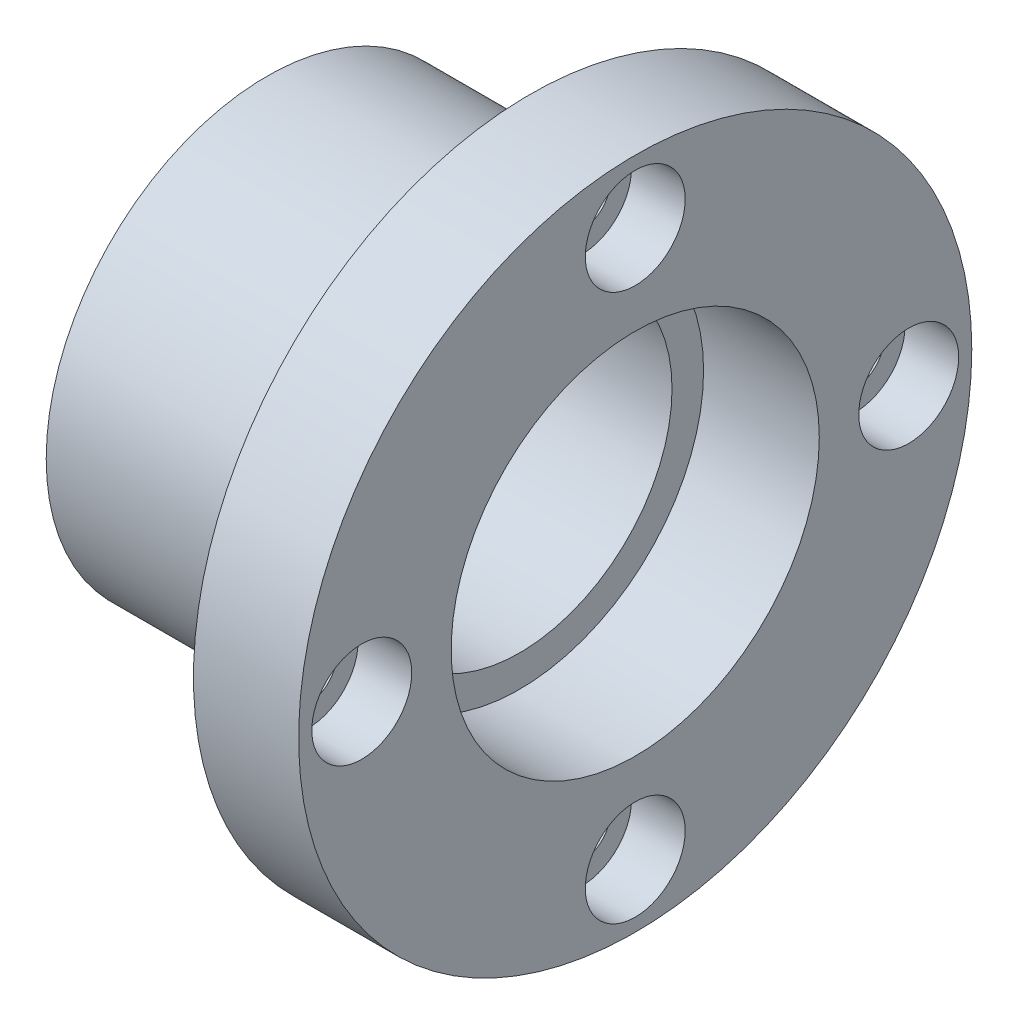
ISO-10303-21;
HEADER;
FILE_DESCRIPTION(('STEP AP214'),'2;1');
FILE_NAME('part.step','',(''),(''),'','','');
FILE_SCHEMA(('AUTOMOTIVE_DESIGN { 1 0 10303 214 1 1 1 1 }'));
ENDSEC;
DATA;
#1=APPLICATION_CONTEXT('core data for automotive mechanical design processes');
#2=APPLICATION_PROTOCOL_DEFINITION('international standard','automotive_design',2000,#1);
#3=PRODUCT_CONTEXT('',#1,'mechanical');
#4=PRODUCT('Part','Part','',(#3));
#5=PRODUCT_RELATED_PRODUCT_CATEGORY('part','',(#4));
#6=PRODUCT_DEFINITION_FORMATION('','',#4);
#7=PRODUCT_DEFINITION_CONTEXT('part definition',#1,'design');
#8=PRODUCT_DEFINITION('design','',#6,#7);
#9=PRODUCT_DEFINITION_SHAPE('','',#8);
#10=(LENGTH_UNIT() NAMED_UNIT(*) SI_UNIT(.MILLI.,.METRE.));
#11=(NAMED_UNIT(*) PLANE_ANGLE_UNIT() SI_UNIT($,.RADIAN.));
#12=(NAMED_UNIT(*) SI_UNIT($,.STERADIAN.) SOLID_ANGLE_UNIT());
#13=UNCERTAINTY_MEASURE_WITH_UNIT(LENGTH_MEASURE(1.E-05),#10,'distance_accuracy_value','');
#14=(GEOMETRIC_REPRESENTATION_CONTEXT(3) GLOBAL_UNCERTAINTY_ASSIGNED_CONTEXT((#13)) GLOBAL_UNIT_ASSIGNED_CONTEXT((#10,
#11,#12)) REPRESENTATION_CONTEXT('',''));
#15=CARTESIAN_POINT('',(0.,0.,0.));
#16=DIRECTION('',(0.,0.,1.));
#17=DIRECTION('',(1.,0.,0.));
#18=AXIS2_PLACEMENT_3D('',#15,#16,#17);
#19=CARTESIAN_POINT('',(0.,17.5,0.));
#20=DIRECTION('',(-1.,0.,0.));
#21=DIRECTION('',(0.,0.,-1.));
#22=AXIS2_PLACEMENT_3D('',#19,#20,#21);
#23=PLANE('',#22);
#24=CARTESIAN_POINT('',(0.,0.,-26.));
#25=DIRECTION('',(1.,0.,0.));
#26=DIRECTION('',(0.,0.,-1.));
#27=AXIS2_PLACEMENT_3D('',#24,#25,#26);
#28=CIRCLE('',#27,4.75);
#29=CARTESIAN_POINT('',(0.,0.,-30.75));
#30=VERTEX_POINT('',#29);
#31=EDGE_CURVE('E105',#30,#30,#28,.T.);
#32=ORIENTED_EDGE('',*,*,#31,.F.);
#33=EDGE_LOOP('',(#32));
#34=FACE_BOUND('',#33,.T.);
#35=CARTESIAN_POINT('',(0.,26.,0.));
#36=DIRECTION('',(1.,0.,0.));
#37=DIRECTION('',(0.,0.,-1.));
#38=AXIS2_PLACEMENT_3D('',#35,#36,#37);
#39=CIRCLE('',#38,4.75);
#40=CARTESIAN_POINT('',(0.,26.,-4.75));
#41=VERTEX_POINT('',#40);
#42=EDGE_CURVE('E81',#41,#41,#39,.T.);
#43=ORIENTED_EDGE('',*,*,#42,.F.);
#44=EDGE_LOOP('',(#43));
#45=FACE_BOUND('',#44,.T.);
#46=CARTESIAN_POINT('',(0.,0.,0.));
#47=DIRECTION('',(1.,0.,0.));
#48=DIRECTION('',(0.,0.,-1.));
#49=AXIS2_PLACEMENT_3D('',#46,#47,#48);
#50=CIRCLE('',#49,32.);
#51=CARTESIAN_POINT('',(0.,0.,-32.));
#52=VERTEX_POINT('',#51);
#53=EDGE_CURVE('E63',#52,#52,#50,.T.);
#54=ORIENTED_EDGE('',*,*,#53,.T.);
#55=EDGE_LOOP('',(#54));
#56=FACE_BOUND('',#55,.T.);
#57=CARTESIAN_POINT('',(0.,0.,0.));
#58=DIRECTION('',(1.,0.,0.));
#59=DIRECTION('',(0.,0.,-1.));
#60=AXIS2_PLACEMENT_3D('',#57,#58,#59);
#61=CIRCLE('',#60,17.5);
#62=CARTESIAN_POINT('',(0.,0.,-17.5));
#63=VERTEX_POINT('',#62);
#64=EDGE_CURVE('E60',#63,#63,#61,.T.);
#65=ORIENTED_EDGE('',*,*,#64,.F.);
#66=EDGE_LOOP('',(#65));
#67=FACE_BOUND('',#66,.T.);
#68=CARTESIAN_POINT('',(0.,0.,26.));
#69=DIRECTION('',(1.,0.,0.));
#70=DIRECTION('',(0.,0.,-1.));
#71=AXIS2_PLACEMENT_3D('',#68,#69,#70);
#72=CIRCLE('',#71,4.75);
#73=CARTESIAN_POINT('',(0.,0.,21.25));
#74=VERTEX_POINT('',#73);
#75=EDGE_CURVE('E93',#74,#74,#72,.T.);
#76=ORIENTED_EDGE('',*,*,#75,.F.);
#77=EDGE_LOOP('',(#76));
#78=FACE_BOUND('',#77,.T.);
#79=CARTESIAN_POINT('',(0.,-26.,0.));
#80=DIRECTION('',(1.,0.,0.));
#81=DIRECTION('',(0.,0.,-1.));
#82=AXIS2_PLACEMENT_3D('',#79,#80,#81);
#83=CIRCLE('',#82,4.75);
#84=CARTESIAN_POINT('',(0.,-26.,-4.75));
#85=VERTEX_POINT('',#84);
#86=EDGE_CURVE('E117',#85,#85,#83,.T.);
#87=ORIENTED_EDGE('',*,*,#86,.F.);
#88=EDGE_LOOP('',(#87));
#89=FACE_BOUND('',#88,.T.);
#90=ADVANCED_FACE('F34',(#34,#45,#56,#67,#78,#89),#23,.F.);
#91=CARTESIAN_POINT('',(-10.,32.,0.));
#92=DIRECTION('',(1.,0.,0.));
#93=DIRECTION('',(0.,0.,1.));
#94=AXIS2_PLACEMENT_3D('',#91,#92,#93);
#95=PLANE('',#94);
#96=CARTESIAN_POINT('',(-10.,0.,-26.));
#97=DIRECTION('',(1.,0.,0.));
#98=DIRECTION('',(0.,0.,-1.));
#99=AXIS2_PLACEMENT_3D('',#96,#97,#98);
#100=CIRCLE('',#99,2.75);
#101=CARTESIAN_POINT('',(-10.,0.,-28.75));
#102=VERTEX_POINT('',#101);
#103=EDGE_CURVE('E96',#102,#102,#100,.T.);
#104=ORIENTED_EDGE('',*,*,#103,.T.);
#105=EDGE_LOOP('',(#104));
#106=FACE_BOUND('',#105,.T.);
#107=CARTESIAN_POINT('',(-10.,26.,0.));
#108=DIRECTION('',(1.,0.,0.));
#109=DIRECTION('',(0.,0.,-1.));
#110=AXIS2_PLACEMENT_3D('',#107,#108,#109);
#111=CIRCLE('',#110,2.75);
#112=CARTESIAN_POINT('',(-10.,26.,-2.75));
#113=VERTEX_POINT('',#112);
#114=EDGE_CURVE('E72',#113,#113,#111,.T.);
#115=ORIENTED_EDGE('',*,*,#114,.T.);
#116=EDGE_LOOP('',(#115));
#117=FACE_BOUND('',#116,.T.);
#118=CARTESIAN_POINT('',(-10.,0.,0.));
#119=DIRECTION('',(1.,0.,0.));
#120=DIRECTION('',(0.,0.,-1.));
#121=AXIS2_PLACEMENT_3D('',#118,#119,#120);
#122=CIRCLE('',#121,21.);
#123=CARTESIAN_POINT('',(-10.,0.,-21.));
#124=VERTEX_POINT('',#123);
#125=EDGE_CURVE('E69',#124,#124,#122,.T.);
#126=ORIENTED_EDGE('',*,*,#125,.T.);
#127=EDGE_LOOP('',(#126));
#128=FACE_BOUND('',#127,.T.);
#129=CARTESIAN_POINT('',(-10.,0.,0.));
#130=DIRECTION('',(1.,0.,0.));
#131=DIRECTION('',(0.,0.,-1.));
#132=AXIS2_PLACEMENT_3D('',#129,#130,#131);
#133=CIRCLE('',#132,32.);
#134=CARTESIAN_POINT('',(-10.,0.,-32.));
#135=VERTEX_POINT('',#134);
#136=EDGE_CURVE('E66',#135,#135,#133,.T.);
#137=ORIENTED_EDGE('',*,*,#136,.F.);
#138=EDGE_LOOP('',(#137));
#139=FACE_BOUND('',#138,.T.);
#140=CARTESIAN_POINT('',(-10.,0.,26.));
#141=DIRECTION('',(1.,0.,0.));
#142=DIRECTION('',(0.,0.,-1.));
#143=AXIS2_PLACEMENT_3D('',#140,#141,#142);
#144=CIRCLE('',#143,2.75);
#145=CARTESIAN_POINT('',(-10.,0.,23.25));
#146=VERTEX_POINT('',#145);
#147=EDGE_CURVE('E84',#146,#146,#144,.T.);
#148=ORIENTED_EDGE('',*,*,#147,.T.);
#149=EDGE_LOOP('',(#148));
#150=FACE_BOUND('',#149,.T.);
#151=CARTESIAN_POINT('',(-10.,-26.,0.));
#152=DIRECTION('',(1.,0.,0.));
#153=DIRECTION('',(0.,0.,-1.));
#154=AXIS2_PLACEMENT_3D('',#151,#152,#153);
#155=CIRCLE('',#154,2.75);
#156=CARTESIAN_POINT('',(-10.,-26.,-2.75));
#157=VERTEX_POINT('',#156);
#158=EDGE_CURVE('E108',#157,#157,#155,.T.);
#159=ORIENTED_EDGE('',*,*,#158,.T.);
#160=EDGE_LOOP('',(#159));
#161=FACE_BOUND('',#160,.T.);
#162=ADVANCED_FACE('F124',(#106,#117,#128,#139,#150,#161),#95,.F.);
#163=CARTESIAN_POINT('',(0.,0.,0.));
#164=DIRECTION('',(-1.,0.,0.));
#165=DIRECTION('',(0.,0.,-1.));
#166=AXIS2_PLACEMENT_3D('',#163,#164,#165);
#167=CYLINDRICAL_SURFACE('',#166,21.);
#168=CARTESIAN_POINT('',(-35.,0.,0.));
#169=DIRECTION('',(1.,0.,0.));
#170=DIRECTION('',(0.,0.,-1.));
#171=AXIS2_PLACEMENT_3D('',#168,#169,#170);
#172=CIRCLE('',#171,21.);
#173=CARTESIAN_POINT('',(-35.,0.,-21.));
#174=VERTEX_POINT('',#173);
#175=EDGE_CURVE('E10',#174,#174,#172,.T.);
#176=ORIENTED_EDGE('',*,*,#175,.T.);
#177=EDGE_LOOP('',(#176));
#178=FACE_BOUND('',#177,.T.);
#179=ORIENTED_EDGE('',*,*,#125,.F.);
#180=EDGE_LOOP('',(#179));
#181=FACE_BOUND('',#180,.T.);
#182=ADVANCED_FACE('F36',(#178,#181),#167,.T.);
#183=CARTESIAN_POINT('',(-35.,21.,0.));
#184=DIRECTION('',(1.,0.,0.));
#185=DIRECTION('',(0.,0.,1.));
#186=AXIS2_PLACEMENT_3D('',#183,#184,#185);
#187=PLANE('',#186);
#188=CARTESIAN_POINT('',(-35.,0.,0.));
#189=DIRECTION('',(1.,0.,0.));
#190=DIRECTION('',(0.,0.,-1.));
#191=AXIS2_PLACEMENT_3D('',#188,#189,#190);
#192=CIRCLE('',#191,17.5);
#193=CARTESIAN_POINT('',(-35.,0.,-17.5));
#194=VERTEX_POINT('',#193);
#195=EDGE_CURVE('E41',#194,#194,#192,.T.);
#196=ORIENTED_EDGE('',*,*,#195,.T.);
#197=EDGE_LOOP('',(#196));
#198=FACE_BOUND('',#197,.T.);
#199=ORIENTED_EDGE('',*,*,#175,.F.);
#200=EDGE_LOOP('',(#199));
#201=FACE_BOUND('',#200,.T.);
#202=ADVANCED_FACE('F155',(#198,#201),#187,.F.);
#203=CARTESIAN_POINT('',(0.,0.,0.));
#204=DIRECTION('',(-1.,0.,0.));
#205=DIRECTION('',(0.,0.,-1.));
#206=AXIS2_PLACEMENT_3D('',#203,#204,#205);
#207=CYLINDRICAL_SURFACE('',#206,17.5);
#208=CARTESIAN_POINT('',(-24.,0.,0.));
#209=DIRECTION('',(1.,0.,0.));
#210=DIRECTION('',(0.,0.,-1.));
#211=AXIS2_PLACEMENT_3D('',#208,#209,#210);
#212=CIRCLE('',#211,17.5);
#213=CARTESIAN_POINT('',(-24.,0.,-17.5));
#214=VERTEX_POINT('',#213);
#215=EDGE_CURVE('E45',#214,#214,#212,.T.);
#216=ORIENTED_EDGE('',*,*,#215,.T.);
#217=EDGE_LOOP('',(#216));
#218=FACE_BOUND('',#217,.T.);
#219=ORIENTED_EDGE('',*,*,#195,.F.);
#220=EDGE_LOOP('',(#219));
#221=FACE_BOUND('',#220,.T.);
#222=ADVANCED_FACE('F152',(#218,#221),#207,.F.);
#223=CARTESIAN_POINT('',(-24.,17.5,0.));
#224=DIRECTION('',(1.,0.,0.));
#225=DIRECTION('',(0.,0.,1.));
#226=AXIS2_PLACEMENT_3D('',#223,#224,#225);
#227=PLANE('',#226);
#228=CARTESIAN_POINT('',(-24.,0.,0.));
#229=DIRECTION('',(1.,0.,0.));
#230=DIRECTION('',(0.,0.,-1.));
#231=AXIS2_PLACEMENT_3D('',#228,#229,#230);
#232=CIRCLE('',#231,14.5);
#233=CARTESIAN_POINT('',(-24.,0.,-14.5));
#234=VERTEX_POINT('',#233);
#235=EDGE_CURVE('E49',#234,#234,#232,.T.);
#236=ORIENTED_EDGE('',*,*,#235,.T.);
#237=EDGE_LOOP('',(#236));
#238=FACE_BOUND('',#237,.T.);
#239=ORIENTED_EDGE('',*,*,#215,.F.);
#240=EDGE_LOOP('',(#239));
#241=FACE_BOUND('',#240,.T.);
#242=ADVANCED_FACE('F148',(#238,#241),#227,.F.);
#243=CARTESIAN_POINT('',(0.,0.,0.));
#244=DIRECTION('',(-1.,0.,0.));
#245=DIRECTION('',(0.,0.,-1.));
#246=AXIS2_PLACEMENT_3D('',#243,#244,#245);
#247=CYLINDRICAL_SURFACE('',#246,14.5);
#248=CARTESIAN_POINT('',(-11.,0.,0.));
#249=DIRECTION('',(1.,0.,0.));
#250=DIRECTION('',(0.,0.,-1.));
#251=AXIS2_PLACEMENT_3D('',#248,#249,#250);
#252=CIRCLE('',#251,14.5);
#253=CARTESIAN_POINT('',(-11.,0.,-14.5));
#254=VERTEX_POINT('',#253);
#255=EDGE_CURVE('E54',#254,#254,#252,.T.);
#256=ORIENTED_EDGE('',*,*,#255,.T.);
#257=EDGE_LOOP('',(#256));
#258=FACE_BOUND('',#257,.T.);
#259=ORIENTED_EDGE('',*,*,#235,.F.);
#260=EDGE_LOOP('',(#259));
#261=FACE_BOUND('',#260,.T.);
#262=ADVANCED_FACE('F144',(#258,#261),#247,.F.);
#263=CARTESIAN_POINT('',(-11.,14.5,0.));
#264=DIRECTION('',(-1.,0.,0.));
#265=DIRECTION('',(0.,0.,-1.));
#266=AXIS2_PLACEMENT_3D('',#263,#264,#265);
#267=PLANE('',#266);
#268=CARTESIAN_POINT('',(-11.,0.,0.));
#269=DIRECTION('',(1.,0.,0.));
#270=DIRECTION('',(0.,0.,-1.));
#271=AXIS2_PLACEMENT_3D('',#268,#269,#270);
#272=CIRCLE('',#271,17.5);
#273=CARTESIAN_POINT('',(-11.,0.,-17.5));
#274=VERTEX_POINT('',#273);
#275=EDGE_CURVE('E57',#274,#274,#272,.T.);
#276=ORIENTED_EDGE('',*,*,#275,.T.);
#277=EDGE_LOOP('',(#276));
#278=FACE_BOUND('',#277,.T.);
#279=ORIENTED_EDGE('',*,*,#255,.F.);
#280=EDGE_LOOP('',(#279));
#281=FACE_BOUND('',#280,.T.);
#282=ADVANCED_FACE('F140',(#278,#281),#267,.F.);
#283=CARTESIAN_POINT('',(0.,0.,0.));
#284=DIRECTION('',(-1.,0.,0.));
#285=DIRECTION('',(0.,0.,-1.));
#286=AXIS2_PLACEMENT_3D('',#283,#284,#285);
#287=CYLINDRICAL_SURFACE('',#286,17.5);
#288=ORIENTED_EDGE('',*,*,#64,.T.);
#289=EDGE_LOOP('',(#288));
#290=FACE_BOUND('',#289,.T.);
#291=ORIENTED_EDGE('',*,*,#275,.F.);
#292=EDGE_LOOP('',(#291));
#293=FACE_BOUND('',#292,.T.);
#294=ADVANCED_FACE('F137',(#290,#293),#287,.F.);
#295=CARTESIAN_POINT('',(0.,0.,0.));
#296=DIRECTION('',(-1.,0.,0.));
#297=DIRECTION('',(0.,0.,-1.));
#298=AXIS2_PLACEMENT_3D('',#295,#296,#297);
#299=CYLINDRICAL_SURFACE('',#298,32.);
#300=ORIENTED_EDGE('',*,*,#136,.T.);
#301=EDGE_LOOP('',(#300));
#302=FACE_BOUND('',#301,.T.);
#303=ORIENTED_EDGE('',*,*,#53,.F.);
#304=EDGE_LOOP('',(#303));
#305=FACE_BOUND('',#304,.T.);
#306=ADVANCED_FACE('F136',(#302,#305),#299,.T.);
#307=CARTESIAN_POINT('',(0.,26.,0.));
#308=DIRECTION('',(-1.,0.,0.));
#309=DIRECTION('',(0.,0.,-1.));
#310=AXIS2_PLACEMENT_3D('',#307,#308,#309);
#311=CYLINDRICAL_SURFACE('',#310,2.75);
#312=ORIENTED_EDGE('',*,*,#114,.F.);
#313=EDGE_LOOP('',(#312));
#314=FACE_BOUND('',#313,.T.);
#315=CARTESIAN_POINT('',(-5.1,26.,0.));
#316=DIRECTION('',(1.,0.,0.));
#317=DIRECTION('',(0.,0.,-1.));
#318=AXIS2_PLACEMENT_3D('',#315,#316,#317);
#319=CIRCLE('',#318,2.75);
#320=CARTESIAN_POINT('',(-5.1,26.,-2.75));
#321=VERTEX_POINT('',#320);
#322=EDGE_CURVE('E75',#321,#321,#319,.T.);
#323=ORIENTED_EDGE('',*,*,#322,.T.);
#324=EDGE_LOOP('',(#323));
#325=FACE_BOUND('',#324,.T.);
#326=ADVANCED_FACE('F222',(#314,#325),#311,.F.);
#327=CARTESIAN_POINT('',(-5.1,28.75,0.));
#328=DIRECTION('',(1.,0.,0.));
#329=DIRECTION('',(0.,0.,1.));
#330=AXIS2_PLACEMENT_3D('',#327,#328,#329);
#331=PLANE('',#330);
#332=ORIENTED_EDGE('',*,*,#322,.F.);
#333=EDGE_LOOP('',(#332));
#334=FACE_BOUND('',#333,.T.);
#335=CARTESIAN_POINT('',(-5.1,26.,0.));
#336=DIRECTION('',(1.,0.,0.));
#337=DIRECTION('',(0.,0.,-1.));
#338=AXIS2_PLACEMENT_3D('',#335,#336,#337);
#339=CIRCLE('',#338,4.75);
#340=CARTESIAN_POINT('',(-5.1,26.,-4.75));
#341=VERTEX_POINT('',#340);
#342=EDGE_CURVE('E78',#341,#341,#339,.T.);
#343=ORIENTED_EDGE('',*,*,#342,.T.);
#344=EDGE_LOOP('',(#343));
#345=FACE_BOUND('',#344,.T.);
#346=ADVANCED_FACE('F218',(#334,#345),#331,.T.);
#347=CARTESIAN_POINT('',(0.,26.,0.));
#348=DIRECTION('',(-1.,0.,0.));
#349=DIRECTION('',(0.,0.,-1.));
#350=AXIS2_PLACEMENT_3D('',#347,#348,#349);
#351=CYLINDRICAL_SURFACE('',#350,4.75);
#352=ORIENTED_EDGE('',*,*,#342,.F.);
#353=EDGE_LOOP('',(#352));
#354=FACE_BOUND('',#353,.T.);
#355=ORIENTED_EDGE('',*,*,#42,.T.);
#356=EDGE_LOOP('',(#355));
#357=FACE_BOUND('',#356,.T.);
#358=ADVANCED_FACE('F214',(#354,#357),#351,.F.);
#359=CARTESIAN_POINT('',(0.,0.,26.));
#360=DIRECTION('',(-1.,0.,0.));
#361=DIRECTION('',(0.,0.,-1.));
#362=AXIS2_PLACEMENT_3D('',#359,#360,#361);
#363=CYLINDRICAL_SURFACE('',#362,2.75);
#364=ORIENTED_EDGE('',*,*,#147,.F.);
#365=EDGE_LOOP('',(#364));
#366=FACE_BOUND('',#365,.T.);
#367=CARTESIAN_POINT('',(-5.1,0.,26.));
#368=DIRECTION('',(1.,0.,0.));
#369=DIRECTION('',(0.,0.,-1.));
#370=AXIS2_PLACEMENT_3D('',#367,#368,#369);
#371=CIRCLE('',#370,2.75);
#372=CARTESIAN_POINT('',(-5.1,0.,23.25));
#373=VERTEX_POINT('',#372);
#374=EDGE_CURVE('E87',#373,#373,#371,.T.);
#375=ORIENTED_EDGE('',*,*,#374,.T.);
#376=EDGE_LOOP('',(#375));
#377=FACE_BOUND('',#376,.T.);
#378=ADVANCED_FACE('F210',(#366,#377),#363,.F.);
#379=CARTESIAN_POINT('',(-5.1,2.74999999999998,26.));
#380=DIRECTION('',(1.,0.,0.));
#381=DIRECTION('',(0.,0.,1.));
#382=AXIS2_PLACEMENT_3D('',#379,#380,#381);
#383=PLANE('',#382);
#384=ORIENTED_EDGE('',*,*,#374,.F.);
#385=EDGE_LOOP('',(#384));
#386=FACE_BOUND('',#385,.T.);
#387=CARTESIAN_POINT('',(-5.1,0.,26.));
#388=DIRECTION('',(1.,0.,0.));
#389=DIRECTION('',(0.,0.,-1.));
#390=AXIS2_PLACEMENT_3D('',#387,#388,#389);
#391=CIRCLE('',#390,4.75);
#392=CARTESIAN_POINT('',(-5.1,0.,21.25));
#393=VERTEX_POINT('',#392);
#394=EDGE_CURVE('E90',#393,#393,#391,.T.);
#395=ORIENTED_EDGE('',*,*,#394,.T.);
#396=EDGE_LOOP('',(#395));
#397=FACE_BOUND('',#396,.T.);
#398=ADVANCED_FACE('F206',(#386,#397),#383,.T.);
#399=CARTESIAN_POINT('',(0.,0.,26.));
#400=DIRECTION('',(-1.,0.,0.));
#401=DIRECTION('',(0.,0.,-1.));
#402=AXIS2_PLACEMENT_3D('',#399,#400,#401);
#403=CYLINDRICAL_SURFACE('',#402,4.75);
#404=ORIENTED_EDGE('',*,*,#394,.F.);
#405=EDGE_LOOP('',(#404));
#406=FACE_BOUND('',#405,.T.);
#407=ORIENTED_EDGE('',*,*,#75,.T.);
#408=EDGE_LOOP('',(#407));
#409=FACE_BOUND('',#408,.T.);
#410=ADVANCED_FACE('F202',(#406,#409),#403,.F.);
#411=CARTESIAN_POINT('',(0.,0.,-26.));
#412=DIRECTION('',(-1.,0.,0.));
#413=DIRECTION('',(0.,0.,-1.));
#414=AXIS2_PLACEMENT_3D('',#411,#412,#413);
#415=CYLINDRICAL_SURFACE('',#414,2.75);
#416=ORIENTED_EDGE('',*,*,#103,.F.);
#417=EDGE_LOOP('',(#416));
#418=FACE_BOUND('',#417,.T.);
#419=CARTESIAN_POINT('',(-5.1,0.,-26.));
#420=DIRECTION('',(1.,0.,0.));
#421=DIRECTION('',(0.,0.,-1.));
#422=AXIS2_PLACEMENT_3D('',#419,#420,#421);
#423=CIRCLE('',#422,2.75);
#424=CARTESIAN_POINT('',(-5.1,0.,-28.75));
#425=VERTEX_POINT('',#424);
#426=EDGE_CURVE('E99',#425,#425,#423,.T.);
#427=ORIENTED_EDGE('',*,*,#426,.T.);
#428=EDGE_LOOP('',(#427));
#429=FACE_BOUND('',#428,.T.);
#430=ADVANCED_FACE('F198',(#418,#429),#415,.F.);
#431=CARTESIAN_POINT('',(-5.1,2.75000000000001,-26.));
#432=DIRECTION('',(1.,0.,0.));
#433=DIRECTION('',(0.,0.,1.));
#434=AXIS2_PLACEMENT_3D('',#431,#432,#433);
#435=PLANE('',#434);
#436=ORIENTED_EDGE('',*,*,#426,.F.);
#437=EDGE_LOOP('',(#436));
#438=FACE_BOUND('',#437,.T.);
#439=CARTESIAN_POINT('',(-5.1,0.,-26.));
#440=DIRECTION('',(1.,0.,0.));
#441=DIRECTION('',(0.,0.,-1.));
#442=AXIS2_PLACEMENT_3D('',#439,#440,#441);
#443=CIRCLE('',#442,4.75);
#444=CARTESIAN_POINT('',(-5.1,0.,-30.75));
#445=VERTEX_POINT('',#444);
#446=EDGE_CURVE('E102',#445,#445,#443,.T.);
#447=ORIENTED_EDGE('',*,*,#446,.T.);
#448=EDGE_LOOP('',(#447));
#449=FACE_BOUND('',#448,.T.);
#450=ADVANCED_FACE('F194',(#438,#449),#435,.T.);
#451=CARTESIAN_POINT('',(0.,0.,-26.));
#452=DIRECTION('',(-1.,0.,0.));
#453=DIRECTION('',(0.,0.,-1.));
#454=AXIS2_PLACEMENT_3D('',#451,#452,#453);
#455=CYLINDRICAL_SURFACE('',#454,4.75);
#456=ORIENTED_EDGE('',*,*,#446,.F.);
#457=EDGE_LOOP('',(#456));
#458=FACE_BOUND('',#457,.T.);
#459=ORIENTED_EDGE('',*,*,#31,.T.);
#460=EDGE_LOOP('',(#459));
#461=FACE_BOUND('',#460,.T.);
#462=ADVANCED_FACE('F178',(#458,#461),#455,.F.);
#463=CARTESIAN_POINT('',(0.,-26.,0.));
#464=DIRECTION('',(-1.,0.,0.));
#465=DIRECTION('',(0.,0.,-1.));
#466=AXIS2_PLACEMENT_3D('',#463,#464,#465);
#467=CYLINDRICAL_SURFACE('',#466,2.75);
#468=ORIENTED_EDGE('',*,*,#158,.F.);
#469=EDGE_LOOP('',(#468));
#470=FACE_BOUND('',#469,.T.);
#471=CARTESIAN_POINT('',(-5.1,-26.,0.));
#472=DIRECTION('',(1.,0.,0.));
#473=DIRECTION('',(0.,0.,-1.));
#474=AXIS2_PLACEMENT_3D('',#471,#472,#473);
#475=CIRCLE('',#474,2.75);
#476=CARTESIAN_POINT('',(-5.1,-26.,-2.75));
#477=VERTEX_POINT('',#476);
#478=EDGE_CURVE('E111',#477,#477,#475,.T.);
#479=ORIENTED_EDGE('',*,*,#478,.T.);
#480=EDGE_LOOP('',(#479));
#481=FACE_BOUND('',#480,.T.);
#482=ADVANCED_FACE('F174',(#470,#481),#467,.F.);
#483=CARTESIAN_POINT('',(-5.1,-23.25,0.));
#484=DIRECTION('',(1.,0.,0.));
#485=DIRECTION('',(0.,0.,1.));
#486=AXIS2_PLACEMENT_3D('',#483,#484,#485);
#487=PLANE('',#486);
#488=ORIENTED_EDGE('',*,*,#478,.F.);
#489=EDGE_LOOP('',(#488));
#490=FACE_BOUND('',#489,.T.);
#491=CARTESIAN_POINT('',(-5.1,-26.,0.));
#492=DIRECTION('',(1.,0.,0.));
#493=DIRECTION('',(0.,0.,-1.));
#494=AXIS2_PLACEMENT_3D('',#491,#492,#493);
#495=CIRCLE('',#494,4.75);
#496=CARTESIAN_POINT('',(-5.1,-26.,-4.75));
#497=VERTEX_POINT('',#496);
#498=EDGE_CURVE('E114',#497,#497,#495,.T.);
#499=ORIENTED_EDGE('',*,*,#498,.T.);
#500=EDGE_LOOP('',(#499));
#501=FACE_BOUND('',#500,.T.);
#502=ADVANCED_FACE('F177',(#490,#501),#487,.T.);
#503=CARTESIAN_POINT('',(0.,-26.,0.));
#504=DIRECTION('',(-1.,0.,0.));
#505=DIRECTION('',(0.,0.,-1.));
#506=AXIS2_PLACEMENT_3D('',#503,#504,#505);
#507=CYLINDRICAL_SURFACE('',#506,4.75);
#508=ORIENTED_EDGE('',*,*,#498,.F.);
#509=EDGE_LOOP('',(#508));
#510=FACE_BOUND('',#509,.T.);
#511=ORIENTED_EDGE('',*,*,#86,.T.);
#512=EDGE_LOOP('',(#511));
#513=FACE_BOUND('',#512,.T.);
#514=ADVANCED_FACE('F121',(#510,#513),#507,.F.);
#515=CLOSED_SHELL('',(#90,#162,#182,#202,#222,#242,#262,#282,#294,#306,#326,#346,#358,#378,#398,
#410,#430,#450,#462,#482,#502,#514));
#516=MANIFOLD_SOLID_BREP('B2',#515);
#517=ADVANCED_BREP_SHAPE_REPRESENTATION('',(#18,#516),#14);
#518=SHAPE_DEFINITION_REPRESENTATION(#9,#517);
ENDSEC;
END-ISO-10303-21;
